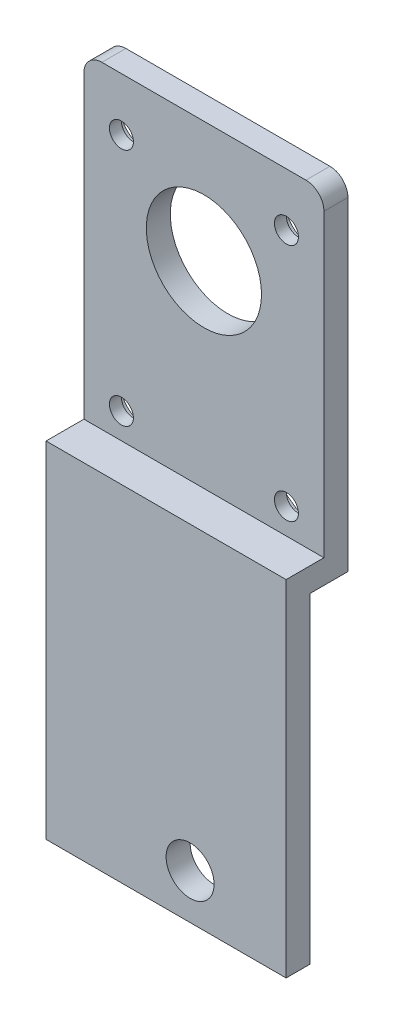
ISO-10303-21;
HEADER;
FILE_DESCRIPTION(('STEP AP214'),'2;1');
FILE_NAME('part.step','',(''),(''),'','','');
FILE_SCHEMA(('AUTOMOTIVE_DESIGN { 1 0 10303 214 1 1 1 1 }'));
ENDSEC;
DATA;
#1=APPLICATION_CONTEXT('core data for automotive mechanical design processes');
#2=APPLICATION_PROTOCOL_DEFINITION('international standard','automotive_design',2000,#1);
#3=PRODUCT_CONTEXT('',#1,'mechanical');
#4=PRODUCT('Part','Part','',(#3));
#5=PRODUCT_RELATED_PRODUCT_CATEGORY('part','',(#4));
#6=PRODUCT_DEFINITION_FORMATION('','',#4);
#7=PRODUCT_DEFINITION_CONTEXT('part definition',#1,'design');
#8=PRODUCT_DEFINITION('design','',#6,#7);
#9=PRODUCT_DEFINITION_SHAPE('','',#8);
#10=(LENGTH_UNIT() NAMED_UNIT(*) SI_UNIT(.MILLI.,.METRE.));
#11=(NAMED_UNIT(*) PLANE_ANGLE_UNIT() SI_UNIT($,.RADIAN.));
#12=(NAMED_UNIT(*) SI_UNIT($,.STERADIAN.) SOLID_ANGLE_UNIT());
#13=UNCERTAINTY_MEASURE_WITH_UNIT(LENGTH_MEASURE(1.E-05),#10,'distance_accuracy_value','');
#14=(GEOMETRIC_REPRESENTATION_CONTEXT(3) GLOBAL_UNCERTAINTY_ASSIGNED_CONTEXT((#13)) GLOBAL_UNIT_ASSIGNED_CONTEXT((#10,
#11,#12)) REPRESENTATION_CONTEXT('',''));
#15=CARTESIAN_POINT('',(0.,0.,0.));
#16=DIRECTION('',(0.,0.,1.));
#17=DIRECTION('',(1.,0.,0.));
#18=AXIS2_PLACEMENT_3D('',#15,#16,#17);
#19=CARTESIAN_POINT('',(-20.,0.,2.));
#20=DIRECTION('',(-1.,0.,0.));
#21=DIRECTION('',(0.,0.,1.));
#22=AXIS2_PLACEMENT_3D('',#19,#20,#21);
#23=PLANE('',#22);
#24=DIRECTION('',(0.,1.,0.));
#25=VECTOR('',#24,1.);
#26=CARTESIAN_POINT('',(-20.,0.,0.));
#27=LINE('',#26,#25);
#28=CARTESIAN_POINT('',(-20.,-28.,0.));
#29=VERTEX_POINT('',#28);
#30=CARTESIAN_POINT('',(-20.,26.,0.));
#31=VERTEX_POINT('',#30);
#32=EDGE_CURVE('E295',#29,#31,#27,.T.);
#33=ORIENTED_EDGE('',*,*,#32,.F.);
#34=DIRECTION('',(0.,0.,-1.));
#35=VECTOR('',#34,1.);
#36=CARTESIAN_POINT('',(-20.,-28.,2.));
#37=LINE('',#36,#35);
#38=CARTESIAN_POINT('',(-20.,-28.,6.3));
#39=VERTEX_POINT('',#38);
#40=EDGE_CURVE('E67',#39,#29,#37,.T.);
#41=ORIENTED_EDGE('',*,*,#40,.F.);
#42=DIRECTION('',(0.,-1.,0.));
#43=VECTOR('',#42,1.);
#44=CARTESIAN_POINT('',(-20.,-24.,6.3));
#45=LINE('',#44,#43);
#46=CARTESIAN_POINT('',(-20.,-81.5,6.3));
#47=VERTEX_POINT('',#46);
#48=EDGE_CURVE('E171',#39,#47,#45,.T.);
#49=ORIENTED_EDGE('',*,*,#48,.T.);
#50=DIRECTION('',(0.,0.,-1.));
#51=VECTOR('',#50,1.);
#52=CARTESIAN_POINT('',(-20.,-81.5,10.3));
#53=LINE('',#52,#51);
#54=CARTESIAN_POINT('',(-20.,-81.5,10.3));
#55=VERTEX_POINT('',#54);
#56=EDGE_CURVE('E148',#55,#47,#53,.T.);
#57=ORIENTED_EDGE('',*,*,#56,.F.);
#58=DIRECTION('',(0.,-1.,0.));
#59=VECTOR('',#58,1.);
#60=CARTESIAN_POINT('',(-20.,-24.,10.3));
#61=LINE('',#60,#59);
#62=CARTESIAN_POINT('',(-20.,-24.,10.3));
#63=VERTEX_POINT('',#62);
#64=EDGE_CURVE('E156',#63,#55,#61,.T.);
#65=ORIENTED_EDGE('',*,*,#64,.F.);
#66=DIRECTION('',(0.,0.,-1.));
#67=VECTOR('',#66,1.);
#68=CARTESIAN_POINT('',(-20.,-24.,6.3));
#69=LINE('',#68,#67);
#70=CARTESIAN_POINT('',(-20.,-24.,4.));
#71=VERTEX_POINT('',#70);
#72=EDGE_CURVE('E184',#63,#71,#69,.T.);
#73=ORIENTED_EDGE('',*,*,#72,.T.);
#74=DIRECTION('',(0.,-1.,0.));
#75=VECTOR('',#74,1.);
#76=CARTESIAN_POINT('',(-20.,26.,4.));
#77=LINE('',#76,#75);
#78=CARTESIAN_POINT('',(-20.,26.,4.));
#79=VERTEX_POINT('',#78);
#80=EDGE_CURVE('E243',#79,#71,#77,.T.);
#81=ORIENTED_EDGE('',*,*,#80,.F.);
#82=DIRECTION('',(0.,0.,-1.));
#83=VECTOR('',#82,1.);
#84=CARTESIAN_POINT('',(-20.,26.,2.));
#85=LINE('',#84,#83);
#86=EDGE_CURVE('E45',#79,#31,#85,.T.);
#87=ORIENTED_EDGE('',*,*,#86,.T.);
#88=EDGE_LOOP('',(#33,#41,#49,#57,#65,#73,#81,#87));
#89=FACE_BOUND('',#88,.T.);
#90=ADVANCED_FACE('F41',(#89),#23,.T.);
#91=CARTESIAN_POINT('',(20.,0.,2.));
#92=DIRECTION('',(-1.,0.,0.));
#93=DIRECTION('',(0.,0.,1.));
#94=AXIS2_PLACEMENT_3D('',#91,#92,#93);
#95=PLANE('',#94);
#96=DIRECTION('',(0.,0.,1.));
#97=VECTOR('',#96,1.);
#98=CARTESIAN_POINT('',(20.,-28.,2.));
#99=LINE('',#98,#97);
#100=CARTESIAN_POINT('',(20.,-28.,0.));
#101=VERTEX_POINT('',#100);
#102=CARTESIAN_POINT('',(20.,-28.,6.3));
#103=VERTEX_POINT('',#102);
#104=EDGE_CURVE('E253',#101,#103,#99,.T.);
#105=ORIENTED_EDGE('',*,*,#104,.F.);
#106=DIRECTION('',(0.,1.,0.));
#107=VECTOR('',#106,1.);
#108=CARTESIAN_POINT('',(20.,0.,0.));
#109=LINE('',#108,#107);
#110=CARTESIAN_POINT('',(20.,26.,0.));
#111=VERTEX_POINT('',#110);
#112=EDGE_CURVE('E298',#101,#111,#109,.T.);
#113=ORIENTED_EDGE('',*,*,#112,.T.);
#114=DIRECTION('',(0.,0.,-1.));
#115=VECTOR('',#114,1.);
#116=CARTESIAN_POINT('',(20.,26.,2.));
#117=LINE('',#116,#115);
#118=CARTESIAN_POINT('',(20.,26.,4.));
#119=VERTEX_POINT('',#118);
#120=EDGE_CURVE('E360',#119,#111,#117,.T.);
#121=ORIENTED_EDGE('',*,*,#120,.F.);
#122=DIRECTION('',(0.,1.,0.));
#123=VECTOR('',#122,1.);
#124=CARTESIAN_POINT('',(20.,26.,4.));
#125=LINE('',#124,#123);
#126=CARTESIAN_POINT('',(20.,-24.,4.));
#127=VERTEX_POINT('',#126);
#128=EDGE_CURVE('E225',#127,#119,#125,.T.);
#129=ORIENTED_EDGE('',*,*,#128,.F.);
#130=DIRECTION('',(0.,0.,-1.));
#131=VECTOR('',#130,1.);
#132=CARTESIAN_POINT('',(20.,-24.,6.3));
#133=LINE('',#132,#131);
#134=CARTESIAN_POINT('',(20.,-24.,10.3));
#135=VERTEX_POINT('',#134);
#136=EDGE_CURVE('E188',#135,#127,#133,.T.);
#137=ORIENTED_EDGE('',*,*,#136,.F.);
#138=DIRECTION('',(0.,1.,0.));
#139=VECTOR('',#138,1.);
#140=CARTESIAN_POINT('',(20.,-24.,10.3));
#141=LINE('',#140,#139);
#142=CARTESIAN_POINT('',(20.,-81.5,10.3));
#143=VERTEX_POINT('',#142);
#144=EDGE_CURVE('E155',#143,#135,#141,.T.);
#145=ORIENTED_EDGE('',*,*,#144,.F.);
#146=DIRECTION('',(0.,0.,-1.));
#147=VECTOR('',#146,1.);
#148=CARTESIAN_POINT('',(20.,-81.5,10.3));
#149=LINE('',#148,#147);
#150=CARTESIAN_POINT('',(20.,-81.5,6.3));
#151=VERTEX_POINT('',#150);
#152=EDGE_CURVE('E150',#143,#151,#149,.T.);
#153=ORIENTED_EDGE('',*,*,#152,.T.);
#154=DIRECTION('',(0.,1.,0.));
#155=VECTOR('',#154,1.);
#156=CARTESIAN_POINT('',(20.,-24.,6.3));
#157=LINE('',#156,#155);
#158=EDGE_CURVE('E167',#151,#103,#157,.T.);
#159=ORIENTED_EDGE('',*,*,#158,.T.);
#160=EDGE_LOOP('',(#105,#113,#121,#129,#137,#145,#153,#159));
#161=FACE_BOUND('',#160,.T.);
#162=ADVANCED_FACE('F381',(#161),#95,.F.);
#163=CARTESIAN_POINT('',(0.,0.,0.));
#164=DIRECTION('',(0.,0.,1.));
#165=DIRECTION('',(1.,0.,0.));
#166=AXIS2_PLACEMENT_3D('',#163,#164,#165);
#167=PLANE('',#166);
#168=CARTESIAN_POINT('',(-13.75,20.15,0.));
#169=DIRECTION('',(0.,0.,1.));
#170=DIRECTION('',(1.,0.,0.));
#171=AXIS2_PLACEMENT_3D('',#168,#169,#170);
#172=CIRCLE('',#171,4.2);
#173=CARTESIAN_POINT('',(-9.55,20.15,0.));
#174=VERTEX_POINT('',#173);
#175=EDGE_CURVE('E269',#174,#174,#172,.T.);
#176=ORIENTED_EDGE('',*,*,#175,.T.);
#177=EDGE_LOOP('',(#176));
#178=FACE_BOUND('',#177,.T.);
#179=CARTESIAN_POINT('',(13.75,20.15,0.));
#180=DIRECTION('',(0.,0.,1.));
#181=DIRECTION('',(1.,0.,0.));
#182=AXIS2_PLACEMENT_3D('',#179,#180,#181);
#183=CIRCLE('',#182,4.19999999999999);
#184=CARTESIAN_POINT('',(17.95,20.15,0.));
#185=VERTEX_POINT('',#184);
#186=EDGE_CURVE('E340',#185,#185,#183,.T.);
#187=ORIENTED_EDGE('',*,*,#186,.T.);
#188=EDGE_LOOP('',(#187));
#189=FACE_BOUND('',#188,.T.);
#190=CARTESIAN_POINT('',(-13.75,-19.7,0.));
#191=DIRECTION('',(0.,0.,1.));
#192=DIRECTION('',(1.,0.,0.));
#193=AXIS2_PLACEMENT_3D('',#190,#191,#192);
#194=CIRCLE('',#193,4.2);
#195=CARTESIAN_POINT('',(-9.55,-19.7,0.));
#196=VERTEX_POINT('',#195);
#197=EDGE_CURVE('E336',#196,#196,#194,.T.);
#198=ORIENTED_EDGE('',*,*,#197,.T.);
#199=EDGE_LOOP('',(#198));
#200=FACE_BOUND('',#199,.T.);
#201=CARTESIAN_POINT('',(9.67691762911674,-16.8,0.));
#202=DIRECTION('',(0.,0.,1.));
#203=DIRECTION('',(1.,0.,0.));
#204=AXIS2_PLACEMENT_3D('',#201,#202,#203);
#205=CIRCLE('',#204,4.19999999999999);
#206=CARTESIAN_POINT('',(12.1129176291167,-13.3786108084581,0.));
#207=VERTEX_POINT('',#206);
#208=CARTESIAN_POINT('',(7.24091762911673,-20.2213891915419,0.));
#209=VERTEX_POINT('',#208);
#210=EDGE_CURVE('E320',#207,#209,#205,.T.);
#211=ORIENTED_EDGE('',*,*,#210,.T.);
#212=DIRECTION('',(-0.81461647417665,0.580000000000002,0.));
#213=VECTOR('',#212,1.);
#214=CARTESIAN_POINT('',(-7.11830783394242,-9.99774280998307,0.));
#215=LINE('',#214,#213);
#216=CARTESIAN_POINT('',(11.314,-23.1213891915419,0.));
#217=VERTEX_POINT('',#216);
#218=EDGE_CURVE('E332',#217,#209,#215,.T.);
#219=ORIENTED_EDGE('',*,*,#218,.F.);
#220=CARTESIAN_POINT('',(13.75,-19.7,0.));
#221=DIRECTION('',(0.,0.,1.));
#222=DIRECTION('',(1.,0.,0.));
#223=AXIS2_PLACEMENT_3D('',#220,#221,#222);
#224=CIRCLE('',#223,4.2);
#225=CARTESIAN_POINT('',(16.186,-16.2786108084581,0.));
#226=VERTEX_POINT('',#225);
#227=EDGE_CURVE('E328',#217,#226,#224,.T.);
#228=ORIENTED_EDGE('',*,*,#227,.T.);
#229=DIRECTION('',(-0.814616474176652,0.58,0.));
#230=VECTOR('',#229,1.);
#231=CARTESIAN_POINT('',(-2.24630783394243,-3.15496442689926,0.));
#232=LINE('',#231,#230);
#233=EDGE_CURVE('E324',#226,#207,#232,.T.);
#234=ORIENTED_EDGE('',*,*,#233,.T.);
#235=EDGE_LOOP('',(#211,#219,#228,#234));
#236=FACE_BOUND('',#235,.T.);
#237=CARTESIAN_POINT('',(0.,8.80000000000001,0.));
#238=DIRECTION('',(0.,0.,1.));
#239=DIRECTION('',(1.,0.,0.));
#240=AXIS2_PLACEMENT_3D('',#237,#238,#239);
#241=CIRCLE('',#240,9.6);
#242=CARTESIAN_POINT('',(9.6,8.80000000000001,0.));
#243=VERTEX_POINT('',#242);
#244=EDGE_CURVE('E316',#243,#243,#241,.T.);
#245=ORIENTED_EDGE('',*,*,#244,.T.);
#246=EDGE_LOOP('',(#245));
#247=FACE_BOUND('',#246,.T.);
#248=CARTESIAN_POINT('',(-5.725,-6.09999999999999,0.));
#249=DIRECTION('',(0.,0.,1.));
#250=DIRECTION('',(1.,0.,0.));
#251=AXIS2_PLACEMENT_3D('',#248,#249,#250);
#252=CIRCLE('',#251,4.2);
#253=CARTESIAN_POINT('',(-1.525,-6.09999999999999,0.));
#254=VERTEX_POINT('',#253);
#255=EDGE_CURVE('E312',#254,#254,#252,.T.);
#256=ORIENTED_EDGE('',*,*,#255,.T.);
#257=EDGE_LOOP('',(#256));
#258=FACE_BOUND('',#257,.T.);
#259=CARTESIAN_POINT('',(5.725,-6.09999999999999,0.));
#260=DIRECTION('',(0.,0.,1.));
#261=DIRECTION('',(1.,0.,0.));
#262=AXIS2_PLACEMENT_3D('',#259,#260,#261);
#263=CIRCLE('',#262,4.2);
#264=CARTESIAN_POINT('',(9.925,-6.09999999999999,0.));
#265=VERTEX_POINT('',#264);
#266=EDGE_CURVE('E308',#265,#265,#263,.T.);
#267=ORIENTED_EDGE('',*,*,#266,.T.);
#268=EDGE_LOOP('',(#267));
#269=FACE_BOUND('',#268,.T.);
#270=DIRECTION('',(1.,0.,0.));
#271=VECTOR('',#270,1.);
#272=CARTESIAN_POINT('',(-20.,-28.,0.));
#273=LINE('',#272,#271);
#274=EDGE_CURVE('E249',#29,#101,#273,.T.);
#275=ORIENTED_EDGE('',*,*,#274,.F.);
#276=ORIENTED_EDGE('',*,*,#32,.T.);
#277=CARTESIAN_POINT('',(-17.,26.,0.));
#278=DIRECTION('',(0.,0.,1.));
#279=DIRECTION('',(1.,0.,0.));
#280=AXIS2_PLACEMENT_3D('',#277,#278,#279);
#281=CIRCLE('',#280,3.);
#282=CARTESIAN_POINT('',(-17.,29.,0.));
#283=VERTEX_POINT('',#282);
#284=EDGE_CURVE('E256',#31,#283,#281,.F.);
#285=ORIENTED_EDGE('',*,*,#284,.T.);
#286=DIRECTION('',(-1.,0.,0.));
#287=VECTOR('',#286,1.);
#288=CARTESIAN_POINT('',(0.,29.,0.));
#289=LINE('',#288,#287);
#290=CARTESIAN_POINT('',(17.,29.,0.));
#291=VERTEX_POINT('',#290);
#292=EDGE_CURVE('E304',#291,#283,#289,.T.);
#293=ORIENTED_EDGE('',*,*,#292,.F.);
#294=CARTESIAN_POINT('',(17.,26.,0.));
#295=DIRECTION('',(0.,0.,1.));
#296=DIRECTION('',(1.,0.,0.));
#297=AXIS2_PLACEMENT_3D('',#294,#295,#296);
#298=CIRCLE('',#297,3.);
#299=EDGE_CURVE('E301',#111,#291,#298,.T.);
#300=ORIENTED_EDGE('',*,*,#299,.F.);
#301=ORIENTED_EDGE('',*,*,#112,.F.);
#302=EDGE_LOOP('',(#275,#276,#285,#293,#300,#301));
#303=FACE_BOUND('',#302,.T.);
#304=ADVANCED_FACE('F375',(#178,#189,#200,#236,#247,#258,#269,#303),#167,.F.);
#305=CARTESIAN_POINT('',(9.67691762911674,-16.8,2.));
#306=DIRECTION('',(0.,0.,-1.));
#307=DIRECTION('',(-1.,0.,0.));
#308=AXIS2_PLACEMENT_3D('',#305,#306,#307);
#309=CYLINDRICAL_SURFACE('',#308,4.19999999999999);
#310=ORIENTED_EDGE('',*,*,#210,.F.);
#311=DIRECTION('',(0.,0.,-1.));
#312=VECTOR('',#311,1.);
#313=CARTESIAN_POINT('',(12.1129176291167,-13.3786108084581,2.));
#314=LINE('',#313,#312);
#315=CARTESIAN_POINT('',(12.1129176291167,-13.3786108084581,2.));
#316=VERTEX_POINT('',#315);
#317=EDGE_CURVE('E11',#316,#207,#314,.T.);
#318=ORIENTED_EDGE('',*,*,#317,.F.);
#319=CARTESIAN_POINT('',(9.67691762911674,-16.8,2.));
#320=DIRECTION('',(0.,0.,1.));
#321=DIRECTION('',(1.,0.,0.));
#322=AXIS2_PLACEMENT_3D('',#319,#320,#321);
#323=CIRCLE('',#322,4.19999999999999);
#324=CARTESIAN_POINT('',(7.24091762911673,-20.2213891915419,2.));
#325=VERTEX_POINT('',#324);
#326=EDGE_CURVE('E265',#316,#325,#323,.T.);
#327=ORIENTED_EDGE('',*,*,#326,.T.);
#328=DIRECTION('',(0.,0.,-1.));
#329=VECTOR('',#328,1.);
#330=CARTESIAN_POINT('',(7.24091762911673,-20.2213891915419,2.));
#331=LINE('',#330,#329);
#332=EDGE_CURVE('E347',#325,#209,#331,.T.);
#333=ORIENTED_EDGE('',*,*,#332,.T.);
#334=EDGE_LOOP('',(#310,#318,#327,#333));
#335=FACE_BOUND('',#334,.T.);
#336=ADVANCED_FACE('F446',(#335),#309,.F.);
#337=CARTESIAN_POINT('',(-2.24630783394243,-3.15496442689926,2.));
#338=DIRECTION('',(-0.58,-0.814616474176652,0.));
#339=DIRECTION('',(0.814616474176652,-0.58,0.));
#340=AXIS2_PLACEMENT_3D('',#337,#338,#339);
#341=PLANE('',#340);
#342=ORIENTED_EDGE('',*,*,#233,.F.);
#343=DIRECTION('',(0.,0.,-1.));
#344=VECTOR('',#343,1.);
#345=CARTESIAN_POINT('',(16.186,-16.2786108084581,2.));
#346=LINE('',#345,#344);
#347=CARTESIAN_POINT('',(16.186,-16.2786108084581,2.));
#348=VERTEX_POINT('',#347);
#349=EDGE_CURVE('E51',#348,#226,#346,.T.);
#350=ORIENTED_EDGE('',*,*,#349,.F.);
#351=DIRECTION('',(-0.814616474176652,0.58,0.));
#352=VECTOR('',#351,1.);
#353=CARTESIAN_POINT('',(-2.24630783394243,-3.15496442689926,2.));
#354=LINE('',#353,#352);
#355=EDGE_CURVE('E268',#348,#316,#354,.T.);
#356=ORIENTED_EDGE('',*,*,#355,.T.);
#357=ORIENTED_EDGE('',*,*,#317,.T.);
#358=EDGE_LOOP('',(#342,#350,#356,#357));
#359=FACE_BOUND('',#358,.T.);
#360=ADVANCED_FACE('F449',(#359),#341,.T.);
#361=CARTESIAN_POINT('',(13.75,-19.7,2.));
#362=DIRECTION('',(0.,0.,-1.));
#363=DIRECTION('',(-1.,0.,0.));
#364=AXIS2_PLACEMENT_3D('',#361,#362,#363);
#365=CYLINDRICAL_SURFACE('',#364,4.2);
#366=ORIENTED_EDGE('',*,*,#227,.F.);
#367=DIRECTION('',(0.,0.,-1.));
#368=VECTOR('',#367,1.);
#369=CARTESIAN_POINT('',(11.314,-23.1213891915419,2.));
#370=LINE('',#369,#368);
#371=CARTESIAN_POINT('',(11.314,-23.1213891915419,2.));
#372=VERTEX_POINT('',#371);
#373=EDGE_CURVE('E350',#372,#217,#370,.T.);
#374=ORIENTED_EDGE('',*,*,#373,.F.);
#375=CARTESIAN_POINT('',(13.75,-19.7,2.));
#376=DIRECTION('',(0.,0.,1.));
#377=DIRECTION('',(1.,0.,0.));
#378=AXIS2_PLACEMENT_3D('',#375,#376,#377);
#379=CIRCLE('',#378,4.2);
#380=EDGE_CURVE('E273',#372,#348,#379,.T.);
#381=ORIENTED_EDGE('',*,*,#380,.T.);
#382=ORIENTED_EDGE('',*,*,#349,.T.);
#383=EDGE_LOOP('',(#366,#374,#381,#382));
#384=FACE_BOUND('',#383,.T.);
#385=ADVANCED_FACE('F453',(#384),#365,.F.);
#386=CARTESIAN_POINT('',(-17.,26.,2.));
#387=DIRECTION('',(0.,0.,-1.));
#388=DIRECTION('',(-1.,0.,0.));
#389=AXIS2_PLACEMENT_3D('',#386,#387,#388);
#390=CYLINDRICAL_SURFACE('',#389,3.);
#391=ORIENTED_EDGE('',*,*,#284,.F.);
#392=ORIENTED_EDGE('',*,*,#86,.F.);
#393=CARTESIAN_POINT('',(-17.,26.,4.));
#394=DIRECTION('',(0.,0.,1.));
#395=DIRECTION('',(1.,0.,0.));
#396=AXIS2_PLACEMENT_3D('',#393,#394,#395);
#397=CIRCLE('',#396,3.);
#398=CARTESIAN_POINT('',(-17.,29.,4.));
#399=VERTEX_POINT('',#398);
#400=EDGE_CURVE('E239',#399,#79,#397,.T.);
#401=ORIENTED_EDGE('',*,*,#400,.F.);
#402=DIRECTION('',(0.,0.,-1.));
#403=VECTOR('',#402,1.);
#404=CARTESIAN_POINT('',(-17.,29.,2.));
#405=LINE('',#404,#403);
#406=EDGE_CURVE('E281',#399,#283,#405,.T.);
#407=ORIENTED_EDGE('',*,*,#406,.T.);
#408=EDGE_LOOP('',(#391,#392,#401,#407));
#409=FACE_BOUND('',#408,.T.);
#410=ADVANCED_FACE('F43',(#409),#390,.T.);
#411=CARTESIAN_POINT('',(17.,26.,2.));
#412=DIRECTION('',(0.,0.,-1.));
#413=DIRECTION('',(-1.,0.,0.));
#414=AXIS2_PLACEMENT_3D('',#411,#412,#413);
#415=CYLINDRICAL_SURFACE('',#414,3.);
#416=ORIENTED_EDGE('',*,*,#299,.T.);
#417=DIRECTION('',(0.,0.,-1.));
#418=VECTOR('',#417,1.);
#419=CARTESIAN_POINT('',(17.,29.,2.));
#420=LINE('',#419,#418);
#421=CARTESIAN_POINT('',(17.,29.,4.));
#422=VERTEX_POINT('',#421);
#423=EDGE_CURVE('E357',#422,#291,#420,.T.);
#424=ORIENTED_EDGE('',*,*,#423,.F.);
#425=CARTESIAN_POINT('',(17.,26.,4.));
#426=DIRECTION('',(0.,0.,1.));
#427=DIRECTION('',(-1.,0.,0.));
#428=AXIS2_PLACEMENT_3D('',#425,#426,#427);
#429=CIRCLE('',#428,3.);
#430=EDGE_CURVE('E231',#119,#422,#429,.T.);
#431=ORIENTED_EDGE('',*,*,#430,.F.);
#432=ORIENTED_EDGE('',*,*,#120,.T.);
#433=EDGE_LOOP('',(#416,#424,#431,#432));
#434=FACE_BOUND('',#433,.T.);
#435=ADVANCED_FACE('F424',(#434),#415,.T.);
#436=CARTESIAN_POINT('',(13.75,20.15,2.));
#437=DIRECTION('',(0.,0.,-1.));
#438=DIRECTION('',(-1.,0.,0.));
#439=AXIS2_PLACEMENT_3D('',#436,#437,#438);
#440=CYLINDRICAL_SURFACE('',#439,4.19999999999999);
#441=CARTESIAN_POINT('',(13.75,20.15,2.));
#442=DIRECTION('',(0.,0.,1.));
#443=DIRECTION('',(1.,0.,0.));
#444=AXIS2_PLACEMENT_3D('',#441,#442,#443);
#445=CIRCLE('',#444,4.19999999999999);
#446=CARTESIAN_POINT('',(17.95,20.15,2.));
#447=VERTEX_POINT('',#446);
#448=EDGE_CURVE('E285',#447,#447,#445,.T.);
#449=ORIENTED_EDGE('',*,*,#448,.T.);
#450=EDGE_LOOP('',(#449));
#451=FACE_BOUND('',#450,.T.);
#452=ORIENTED_EDGE('',*,*,#186,.F.);
#453=EDGE_LOOP('',(#452));
#454=FACE_BOUND('',#453,.T.);
#455=ADVANCED_FACE('F427',(#451,#454),#440,.F.);
#456=CARTESIAN_POINT('',(-13.75,-19.7,2.));
#457=DIRECTION('',(0.,0.,-1.));
#458=DIRECTION('',(-1.,0.,0.));
#459=AXIS2_PLACEMENT_3D('',#456,#457,#458);
#460=CYLINDRICAL_SURFACE('',#459,4.2);
#461=CARTESIAN_POINT('',(-13.75,-19.7,2.));
#462=DIRECTION('',(0.,0.,1.));
#463=DIRECTION('',(1.,0.,0.));
#464=AXIS2_PLACEMENT_3D('',#461,#462,#463);
#465=CIRCLE('',#464,4.2);
#466=CARTESIAN_POINT('',(-9.55,-19.7,2.));
#467=VERTEX_POINT('',#466);
#468=EDGE_CURVE('E264',#467,#467,#465,.T.);
#469=ORIENTED_EDGE('',*,*,#468,.T.);
#470=EDGE_LOOP('',(#469));
#471=FACE_BOUND('',#470,.T.);
#472=ORIENTED_EDGE('',*,*,#197,.F.);
#473=EDGE_LOOP('',(#472));
#474=FACE_BOUND('',#473,.T.);
#475=ADVANCED_FACE('F460',(#471,#474),#460,.F.);
#476=CARTESIAN_POINT('',(-7.11830783394242,-9.99774280998307,2.));
#477=DIRECTION('',(-0.580000000000002,-0.81461647417665,0.));
#478=DIRECTION('',(0.81461647417665,-0.580000000000002,0.));
#479=AXIS2_PLACEMENT_3D('',#476,#477,#478);
#480=PLANE('',#479);
#481=ORIENTED_EDGE('',*,*,#218,.T.);
#482=ORIENTED_EDGE('',*,*,#332,.F.);
#483=DIRECTION('',(-0.81461647417665,0.580000000000002,0.));
#484=VECTOR('',#483,1.);
#485=CARTESIAN_POINT('',(-7.11830783394242,-9.99774280998307,2.));
#486=LINE('',#485,#484);
#487=EDGE_CURVE('E277',#372,#325,#486,.T.);
#488=ORIENTED_EDGE('',*,*,#487,.F.);
#489=ORIENTED_EDGE('',*,*,#373,.T.);
#490=EDGE_LOOP('',(#481,#482,#488,#489));
#491=FACE_BOUND('',#490,.T.);
#492=ADVANCED_FACE('F444',(#491),#480,.F.);
#493=CARTESIAN_POINT('',(0.,8.80000000000001,2.));
#494=DIRECTION('',(0.,0.,-1.));
#495=DIRECTION('',(-1.,0.,0.));
#496=AXIS2_PLACEMENT_3D('',#493,#494,#495);
#497=CYLINDRICAL_SURFACE('',#496,9.6);
#498=ORIENTED_EDGE('',*,*,#244,.F.);
#499=EDGE_LOOP('',(#498));
#500=FACE_BOUND('',#499,.T.);
#501=CARTESIAN_POINT('',(0.,8.80000000000001,4.));
#502=DIRECTION('',(0.,0.,1.));
#503=DIRECTION('',(1.,0.,0.));
#504=AXIS2_PLACEMENT_3D('',#501,#502,#503);
#505=CIRCLE('',#504,9.6);
#506=CARTESIAN_POINT('',(9.6,8.80000000000001,4.));
#507=VERTEX_POINT('',#506);
#508=EDGE_CURVE('E192',#507,#507,#505,.T.);
#509=ORIENTED_EDGE('',*,*,#508,.T.);
#510=EDGE_LOOP('',(#509));
#511=FACE_BOUND('',#510,.T.);
#512=ADVANCED_FACE('F440',(#500,#511),#497,.F.);
#513=CARTESIAN_POINT('',(-5.725,-6.09999999999999,2.));
#514=DIRECTION('',(0.,0.,-1.));
#515=DIRECTION('',(-1.,0.,0.));
#516=AXIS2_PLACEMENT_3D('',#513,#514,#515);
#517=CYLINDRICAL_SURFACE('',#516,4.2);
#518=CARTESIAN_POINT('',(-5.725,-6.09999999999999,2.));
#519=DIRECTION('',(0.,0.,1.));
#520=DIRECTION('',(1.,0.,0.));
#521=AXIS2_PLACEMENT_3D('',#518,#519,#520);
#522=CIRCLE('',#521,4.2);
#523=CARTESIAN_POINT('',(-1.525,-6.09999999999999,2.));
#524=VERTEX_POINT('',#523);
#525=EDGE_CURVE('E260',#524,#524,#522,.T.);
#526=ORIENTED_EDGE('',*,*,#525,.T.);
#527=EDGE_LOOP('',(#526));
#528=FACE_BOUND('',#527,.T.);
#529=ORIENTED_EDGE('',*,*,#255,.F.);
#530=EDGE_LOOP('',(#529));
#531=FACE_BOUND('',#530,.T.);
#532=ADVANCED_FACE('F436',(#528,#531),#517,.F.);
#533=CARTESIAN_POINT('',(5.725,-6.09999999999999,2.));
#534=DIRECTION('',(0.,0.,-1.));
#535=DIRECTION('',(-1.,0.,0.));
#536=AXIS2_PLACEMENT_3D('',#533,#534,#535);
#537=CYLINDRICAL_SURFACE('',#536,4.2);
#538=CARTESIAN_POINT('',(5.725,-6.09999999999999,2.));
#539=DIRECTION('',(0.,0.,1.));
#540=DIRECTION('',(1.,0.,0.));
#541=AXIS2_PLACEMENT_3D('',#538,#539,#540);
#542=CIRCLE('',#541,4.2);
#543=CARTESIAN_POINT('',(9.925,-6.09999999999999,2.));
#544=VERTEX_POINT('',#543);
#545=EDGE_CURVE('E250',#544,#544,#542,.T.);
#546=ORIENTED_EDGE('',*,*,#545,.T.);
#547=EDGE_LOOP('',(#546));
#548=FACE_BOUND('',#547,.T.);
#549=ORIENTED_EDGE('',*,*,#266,.F.);
#550=EDGE_LOOP('',(#549));
#551=FACE_BOUND('',#550,.T.);
#552=ADVANCED_FACE('F432',(#548,#551),#537,.F.);
#553=CARTESIAN_POINT('',(0.,29.,2.));
#554=DIRECTION('',(0.,-1.,0.));
#555=DIRECTION('',(0.,0.,-1.));
#556=AXIS2_PLACEMENT_3D('',#553,#554,#555);
#557=PLANE('',#556);
#558=ORIENTED_EDGE('',*,*,#292,.T.);
#559=ORIENTED_EDGE('',*,*,#406,.F.);
#560=DIRECTION('',(-1.,0.,0.));
#561=VECTOR('',#560,1.);
#562=CARTESIAN_POINT('',(-17.,29.,4.));
#563=LINE('',#562,#561);
#564=EDGE_CURVE('E235',#422,#399,#563,.T.);
#565=ORIENTED_EDGE('',*,*,#564,.F.);
#566=ORIENTED_EDGE('',*,*,#423,.T.);
#567=EDGE_LOOP('',(#558,#559,#565,#566));
#568=FACE_BOUND('',#567,.T.);
#569=ADVANCED_FACE('F428',(#568),#557,.F.);
#570=CARTESIAN_POINT('',(-13.75,20.15,2.));
#571=DIRECTION('',(0.,0.,-1.));
#572=DIRECTION('',(-1.,0.,0.));
#573=AXIS2_PLACEMENT_3D('',#570,#571,#572);
#574=CYLINDRICAL_SURFACE('',#573,4.2);
#575=CARTESIAN_POINT('',(-13.75,20.15,2.));
#576=DIRECTION('',(0.,0.,1.));
#577=DIRECTION('',(1.,0.,0.));
#578=AXIS2_PLACEMENT_3D('',#575,#576,#577);
#579=CIRCLE('',#578,4.2);
#580=CARTESIAN_POINT('',(-9.55,20.15,2.));
#581=VERTEX_POINT('',#580);
#582=EDGE_CURVE('E246',#581,#581,#579,.T.);
#583=ORIENTED_EDGE('',*,*,#582,.T.);
#584=EDGE_LOOP('',(#583));
#585=FACE_BOUND('',#584,.T.);
#586=ORIENTED_EDGE('',*,*,#175,.F.);
#587=EDGE_LOOP('',(#586));
#588=FACE_BOUND('',#587,.T.);
#589=ADVANCED_FACE('F431',(#585,#588),#574,.F.);
#590=CARTESIAN_POINT('',(0.,-28.,0.));
#591=DIRECTION('',(0.,-1.,0.));
#592=DIRECTION('',(0.,0.,-1.));
#593=AXIS2_PLACEMENT_3D('',#590,#591,#592);
#594=PLANE('',#593);
#595=ORIENTED_EDGE('',*,*,#40,.T.);
#596=ORIENTED_EDGE('',*,*,#274,.T.);
#597=ORIENTED_EDGE('',*,*,#104,.T.);
#598=DIRECTION('',(1.,0.,0.));
#599=VECTOR('',#598,1.);
#600=CARTESIAN_POINT('',(-20.,-28.,6.3));
#601=LINE('',#600,#599);
#602=EDGE_CURVE('E177',#39,#103,#601,.T.);
#603=ORIENTED_EDGE('',*,*,#602,.F.);
#604=EDGE_LOOP('',(#595,#596,#597,#603));
#605=FACE_BOUND('',#604,.T.);
#606=ADVANCED_FACE('F378',(#605),#594,.T.);
#607=CARTESIAN_POINT('',(13.75,-19.7,4.));
#608=DIRECTION('',(0.,0.,-1.));
#609=DIRECTION('',(-1.,0.,0.));
#610=AXIS2_PLACEMENT_3D('',#607,#608,#609);
#611=CYLINDRICAL_SURFACE('',#610,2.);
#612=CARTESIAN_POINT('',(13.75,-19.7,4.));
#613=DIRECTION('',(0.,0.,1.));
#614=DIRECTION('',(1.,0.,0.));
#615=AXIS2_PLACEMENT_3D('',#612,#613,#614);
#616=CIRCLE('',#615,2.);
#617=CARTESIAN_POINT('',(15.75,-19.7,4.));
#618=VERTEX_POINT('',#617);
#619=EDGE_CURVE('E197',#618,#618,#616,.T.);
#620=ORIENTED_EDGE('',*,*,#619,.T.);
#621=EDGE_LOOP('',(#620));
#622=FACE_BOUND('',#621,.T.);
#623=CARTESIAN_POINT('',(13.75,-19.7,2.));
#624=DIRECTION('',(0.,0.,1.));
#625=DIRECTION('',(1.,0.,0.));
#626=AXIS2_PLACEMENT_3D('',#623,#624,#625);
#627=CIRCLE('',#626,2.);
#628=CARTESIAN_POINT('',(15.75,-19.7,2.));
#629=VERTEX_POINT('',#628);
#630=EDGE_CURVE('E196',#629,#629,#627,.T.);
#631=ORIENTED_EDGE('',*,*,#630,.F.);
#632=EDGE_LOOP('',(#631));
#633=FACE_BOUND('',#632,.T.);
#634=ADVANCED_FACE('F476',(#622,#633),#611,.F.);
#635=CARTESIAN_POINT('',(13.75,20.15,4.));
#636=DIRECTION('',(0.,0.,-1.));
#637=DIRECTION('',(-1.,0.,0.));
#638=AXIS2_PLACEMENT_3D('',#635,#636,#637);
#639=CYLINDRICAL_SURFACE('',#638,2.);
#640=CARTESIAN_POINT('',(13.75,20.15,4.));
#641=DIRECTION('',(0.,0.,1.));
#642=DIRECTION('',(1.,0.,0.));
#643=AXIS2_PLACEMENT_3D('',#640,#641,#642);
#644=CIRCLE('',#643,2.);
#645=CARTESIAN_POINT('',(15.75,20.15,4.));
#646=VERTEX_POINT('',#645);
#647=EDGE_CURVE('E205',#646,#646,#644,.T.);
#648=ORIENTED_EDGE('',*,*,#647,.T.);
#649=EDGE_LOOP('',(#648));
#650=FACE_BOUND('',#649,.T.);
#651=CARTESIAN_POINT('',(13.75,20.15,2.));
#652=DIRECTION('',(0.,0.,1.));
#653=DIRECTION('',(1.,0.,0.));
#654=AXIS2_PLACEMENT_3D('',#651,#652,#653);
#655=CIRCLE('',#654,2.);
#656=CARTESIAN_POINT('',(15.75,20.15,2.));
#657=VERTEX_POINT('',#656);
#658=EDGE_CURVE('E201',#657,#657,#655,.T.);
#659=ORIENTED_EDGE('',*,*,#658,.F.);
#660=EDGE_LOOP('',(#659));
#661=FACE_BOUND('',#660,.T.);
#662=ADVANCED_FACE('F493',(#650,#661),#639,.F.);
#663=CARTESIAN_POINT('',(-13.75,20.15,4.));
#664=DIRECTION('',(0.,0.,-1.));
#665=DIRECTION('',(-1.,0.,0.));
#666=AXIS2_PLACEMENT_3D('',#663,#664,#665);
#667=CYLINDRICAL_SURFACE('',#666,2.);
#668=CARTESIAN_POINT('',(-13.75,20.15,4.));
#669=DIRECTION('',(0.,0.,1.));
#670=DIRECTION('',(1.,0.,0.));
#671=AXIS2_PLACEMENT_3D('',#668,#669,#670);
#672=CIRCLE('',#671,2.);
#673=CARTESIAN_POINT('',(-11.75,20.15,4.));
#674=VERTEX_POINT('',#673);
#675=EDGE_CURVE('E213',#674,#674,#672,.T.);
#676=ORIENTED_EDGE('',*,*,#675,.T.);
#677=EDGE_LOOP('',(#676));
#678=FACE_BOUND('',#677,.T.);
#679=CARTESIAN_POINT('',(-13.75,20.15,2.));
#680=DIRECTION('',(0.,0.,1.));
#681=DIRECTION('',(1.,0.,0.));
#682=AXIS2_PLACEMENT_3D('',#679,#680,#681);
#683=CIRCLE('',#682,2.);
#684=CARTESIAN_POINT('',(-11.75,20.15,2.));
#685=VERTEX_POINT('',#684);
#686=EDGE_CURVE('E209',#685,#685,#683,.T.);
#687=ORIENTED_EDGE('',*,*,#686,.F.);
#688=EDGE_LOOP('',(#687));
#689=FACE_BOUND('',#688,.T.);
#690=ADVANCED_FACE('F489',(#678,#689),#667,.F.);
#691=CARTESIAN_POINT('',(-13.75,-19.7,4.));
#692=DIRECTION('',(0.,0.,-1.));
#693=DIRECTION('',(-1.,0.,0.));
#694=AXIS2_PLACEMENT_3D('',#691,#692,#693);
#695=CYLINDRICAL_SURFACE('',#694,2.);
#696=CARTESIAN_POINT('',(-13.75,-19.7,4.));
#697=DIRECTION('',(0.,0.,1.));
#698=DIRECTION('',(1.,0.,0.));
#699=AXIS2_PLACEMENT_3D('',#696,#697,#698);
#700=CIRCLE('',#699,2.);
#701=CARTESIAN_POINT('',(-11.75,-19.7,4.));
#702=VERTEX_POINT('',#701);
#703=EDGE_CURVE('E221',#702,#702,#700,.T.);
#704=ORIENTED_EDGE('',*,*,#703,.T.);
#705=EDGE_LOOP('',(#704));
#706=FACE_BOUND('',#705,.T.);
#707=CARTESIAN_POINT('',(-13.75,-19.7,2.));
#708=DIRECTION('',(0.,0.,1.));
#709=DIRECTION('',(1.,0.,0.));
#710=AXIS2_PLACEMENT_3D('',#707,#708,#709);
#711=CIRCLE('',#710,2.);
#712=CARTESIAN_POINT('',(-11.75,-19.7,2.));
#713=VERTEX_POINT('',#712);
#714=EDGE_CURVE('E217',#713,#713,#711,.T.);
#715=ORIENTED_EDGE('',*,*,#714,.F.);
#716=EDGE_LOOP('',(#715));
#717=FACE_BOUND('',#716,.T.);
#718=ADVANCED_FACE('F486',(#706,#717),#695,.F.);
#719=CARTESIAN_POINT('',(-17.,26.,4.));
#720=DIRECTION('',(0.,0.,1.));
#721=DIRECTION('',(1.,0.,0.));
#722=AXIS2_PLACEMENT_3D('',#719,#720,#721);
#723=PLANE('',#722);
#724=DIRECTION('',(-1.,0.,0.));
#725=VECTOR('',#724,1.);
#726=CARTESIAN_POINT('',(-20.,-24.,4.));
#727=LINE('',#726,#725);
#728=EDGE_CURVE('E59',#127,#71,#727,.T.);
#729=ORIENTED_EDGE('',*,*,#728,.F.);
#730=ORIENTED_EDGE('',*,*,#128,.T.);
#731=ORIENTED_EDGE('',*,*,#430,.T.);
#732=ORIENTED_EDGE('',*,*,#564,.T.);
#733=ORIENTED_EDGE('',*,*,#400,.T.);
#734=ORIENTED_EDGE('',*,*,#80,.T.);
#735=EDGE_LOOP('',(#729,#730,#731,#732,#733,#734));
#736=FACE_BOUND('',#735,.T.);
#737=ORIENTED_EDGE('',*,*,#619,.F.);
#738=EDGE_LOOP('',(#737));
#739=FACE_BOUND('',#738,.T.);
#740=ORIENTED_EDGE('',*,*,#675,.F.);
#741=EDGE_LOOP('',(#740));
#742=FACE_BOUND('',#741,.T.);
#743=ORIENTED_EDGE('',*,*,#703,.F.);
#744=EDGE_LOOP('',(#743));
#745=FACE_BOUND('',#744,.T.);
#746=ORIENTED_EDGE('',*,*,#647,.F.);
#747=EDGE_LOOP('',(#746));
#748=FACE_BOUND('',#747,.T.);
#749=ORIENTED_EDGE('',*,*,#508,.F.);
#750=EDGE_LOOP('',(#749));
#751=FACE_BOUND('',#750,.T.);
#752=ADVANCED_FACE('F483',(#736,#739,#742,#745,#748,#751),#723,.T.);
#753=CARTESIAN_POINT('',(-17.,26.,2.));
#754=DIRECTION('',(0.,0.,1.));
#755=DIRECTION('',(1.,0.,0.));
#756=AXIS2_PLACEMENT_3D('',#753,#754,#755);
#757=PLANE('',#756);
#758=ORIENTED_EDGE('',*,*,#686,.T.);
#759=EDGE_LOOP('',(#758));
#760=FACE_BOUND('',#759,.T.);
#761=ORIENTED_EDGE('',*,*,#582,.F.);
#762=EDGE_LOOP('',(#761));
#763=FACE_BOUND('',#762,.T.);
#764=ADVANCED_FACE('F482',(#760,#763),#757,.F.);
#765=ORIENTED_EDGE('',*,*,#658,.T.);
#766=EDGE_LOOP('',(#765));
#767=FACE_BOUND('',#766,.T.);
#768=ORIENTED_EDGE('',*,*,#448,.F.);
#769=EDGE_LOOP('',(#768));
#770=FACE_BOUND('',#769,.T.);
#771=ADVANCED_FACE('F520',(#767,#770),#757,.F.);
#772=ORIENTED_EDGE('',*,*,#714,.T.);
#773=EDGE_LOOP('',(#772));
#774=FACE_BOUND('',#773,.T.);
#775=ORIENTED_EDGE('',*,*,#468,.F.);
#776=EDGE_LOOP('',(#775));
#777=FACE_BOUND('',#776,.T.);
#778=ADVANCED_FACE('F523',(#774,#777),#757,.F.);
#779=ORIENTED_EDGE('',*,*,#630,.T.);
#780=EDGE_LOOP('',(#779));
#781=FACE_BOUND('',#780,.T.);
#782=ORIENTED_EDGE('',*,*,#326,.F.);
#783=ORIENTED_EDGE('',*,*,#355,.F.);
#784=ORIENTED_EDGE('',*,*,#380,.F.);
#785=ORIENTED_EDGE('',*,*,#487,.T.);
#786=EDGE_LOOP('',(#782,#783,#784,#785));
#787=FACE_BOUND('',#786,.T.);
#788=ADVANCED_FACE('F549',(#781,#787),#757,.F.);
#789=ORIENTED_EDGE('',*,*,#525,.F.);
#790=EDGE_LOOP('',(#789));
#791=FACE_BOUND('',#790,.T.);
#792=ADVANCED_FACE('F480',(#791),#757,.F.);
#793=ORIENTED_EDGE('',*,*,#545,.F.);
#794=EDGE_LOOP('',(#793));
#795=FACE_BOUND('',#794,.T.);
#796=ADVANCED_FACE('F477',(#795),#757,.F.);
#797=CARTESIAN_POINT('',(-20.,-24.,6.3));
#798=DIRECTION('',(0.,-1.,0.));
#799=DIRECTION('',(0.,0.,-1.));
#800=AXIS2_PLACEMENT_3D('',#797,#798,#799);
#801=PLANE('',#800);
#802=ORIENTED_EDGE('',*,*,#728,.T.);
#803=ORIENTED_EDGE('',*,*,#72,.F.);
#804=DIRECTION('',(-1.,0.,0.));
#805=VECTOR('',#804,1.);
#806=CARTESIAN_POINT('',(-20.,-24.,10.3));
#807=LINE('',#806,#805);
#808=EDGE_CURVE('E163',#135,#63,#807,.T.);
#809=ORIENTED_EDGE('',*,*,#808,.F.);
#810=ORIENTED_EDGE('',*,*,#136,.T.);
#811=EDGE_LOOP('',(#802,#803,#809,#810));
#812=FACE_BOUND('',#811,.T.);
#813=ADVANCED_FACE('F414',(#812),#801,.F.);
#814=CARTESIAN_POINT('',(0.,0.,6.3));
#815=DIRECTION('',(0.,0.,1.));
#816=DIRECTION('',(1.,0.,0.));
#817=AXIS2_PLACEMENT_3D('',#814,#815,#816);
#818=PLANE('',#817);
#819=CARTESIAN_POINT('',(4.00000000000001,-74.,6.3));
#820=DIRECTION('',(0.,0.,1.));
#821=DIRECTION('',(1.,0.,0.));
#822=AXIS2_PLACEMENT_3D('',#819,#820,#821);
#823=CIRCLE('',#822,4.);
#824=CARTESIAN_POINT('',(8.00000000000002,-74.,6.3));
#825=VERTEX_POINT('',#824);
#826=EDGE_CURVE('E396',#825,#825,#823,.T.);
#827=ORIENTED_EDGE('',*,*,#826,.T.);
#828=EDGE_LOOP('',(#827));
#829=FACE_BOUND('',#828,.T.);
#830=ORIENTED_EDGE('',*,*,#48,.F.);
#831=ORIENTED_EDGE('',*,*,#602,.T.);
#832=ORIENTED_EDGE('',*,*,#158,.F.);
#833=DIRECTION('',(1.,0.,0.));
#834=VECTOR('',#833,1.);
#835=CARTESIAN_POINT('',(-20.,-81.5,6.3));
#836=LINE('',#835,#834);
#837=EDGE_CURVE('E385',#47,#151,#836,.T.);
#838=ORIENTED_EDGE('',*,*,#837,.F.);
#839=EDGE_LOOP('',(#830,#831,#832,#838));
#840=FACE_BOUND('',#839,.T.);
#841=ADVANCED_FACE('F407',(#829,#840),#818,.F.);
#842=CARTESIAN_POINT('',(0.,0.,10.3));
#843=DIRECTION('',(0.,0.,1.));
#844=DIRECTION('',(1.,0.,0.));
#845=AXIS2_PLACEMENT_3D('',#842,#843,#844);
#846=PLANE('',#845);
#847=ORIENTED_EDGE('',*,*,#64,.T.);
#848=DIRECTION('',(1.,0.,0.));
#849=VECTOR('',#848,1.);
#850=CARTESIAN_POINT('',(-20.,-81.5,10.3));
#851=LINE('',#850,#849);
#852=EDGE_CURVE('E144',#55,#143,#851,.T.);
#853=ORIENTED_EDGE('',*,*,#852,.T.);
#854=ORIENTED_EDGE('',*,*,#144,.T.);
#855=ORIENTED_EDGE('',*,*,#808,.T.);
#856=EDGE_LOOP('',(#847,#853,#854,#855));
#857=FACE_BOUND('',#856,.T.);
#858=CARTESIAN_POINT('',(4.00000000000001,-74.,10.3));
#859=DIRECTION('',(0.,0.,1.));
#860=DIRECTION('',(1.,0.,0.));
#861=AXIS2_PLACEMENT_3D('',#858,#859,#860);
#862=CIRCLE('',#861,4.);
#863=CARTESIAN_POINT('',(8.00000000000002,-74.,10.3));
#864=VERTEX_POINT('',#863);
#865=EDGE_CURVE('E391',#864,#864,#862,.T.);
#866=ORIENTED_EDGE('',*,*,#865,.F.);
#867=EDGE_LOOP('',(#866));
#868=FACE_BOUND('',#867,.T.);
#869=ADVANCED_FACE('F160',(#857,#868),#846,.T.);
#870=CARTESIAN_POINT('',(-20.,-81.5,10.3));
#871=DIRECTION('',(0.,1.,0.));
#872=DIRECTION('',(0.,0.,1.));
#873=AXIS2_PLACEMENT_3D('',#870,#871,#872);
#874=PLANE('',#873);
#875=ORIENTED_EDGE('',*,*,#837,.T.);
#876=ORIENTED_EDGE('',*,*,#152,.F.);
#877=ORIENTED_EDGE('',*,*,#852,.F.);
#878=ORIENTED_EDGE('',*,*,#56,.T.);
#879=EDGE_LOOP('',(#875,#876,#877,#878));
#880=FACE_BOUND('',#879,.T.);
#881=ADVANCED_FACE('F146',(#880),#874,.F.);
#882=CARTESIAN_POINT('',(4.00000000000001,-74.,10.3));
#883=DIRECTION('',(0.,0.,-1.));
#884=DIRECTION('',(-1.,0.,0.));
#885=AXIS2_PLACEMENT_3D('',#882,#883,#884);
#886=CYLINDRICAL_SURFACE('',#885,4.);
#887=ORIENTED_EDGE('',*,*,#865,.T.);
#888=EDGE_LOOP('',(#887));
#889=FACE_BOUND('',#888,.T.);
#890=ORIENTED_EDGE('',*,*,#826,.F.);
#891=EDGE_LOOP('',(#890));
#892=FACE_BOUND('',#891,.T.);
#893=ADVANCED_FACE('F404',(#889,#892),#886,.F.);
#894=CLOSED_SHELL('',(#90,#162,#304,#336,#360,#385,#410,#435,#455,#475,#492,#512,#532,#552,#569,
#589,#606,#634,#662,#690,#718,#752,#764,#771,#778,#788,#792,#796,#813,#841,#869,#881,#893));
#895=MANIFOLD_SOLID_BREP('B2',#894);
#896=ADVANCED_BREP_SHAPE_REPRESENTATION('',(#18,#895),#14);
#897=SHAPE_DEFINITION_REPRESENTATION(#9,#896);
ENDSEC;
END-ISO-10303-21;
